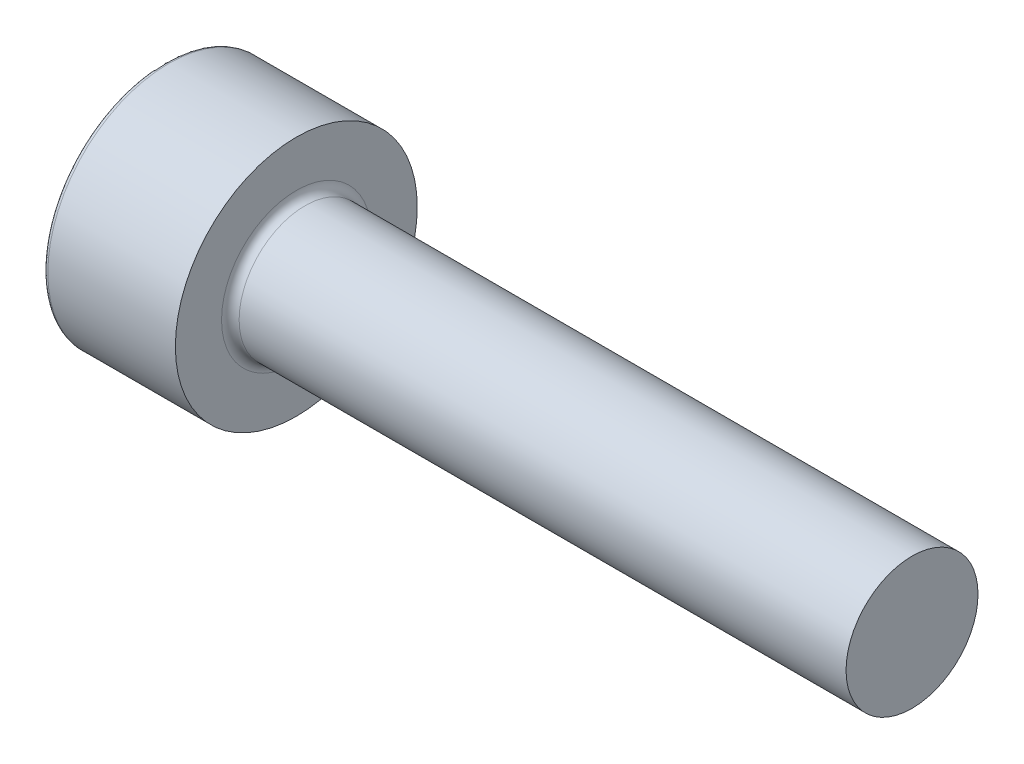
ISO-10303-21;
HEADER;
FILE_DESCRIPTION(('STEP AP214'),'2;1');
FILE_NAME('part.step','',(''),(''),'','','');
FILE_SCHEMA(('AUTOMOTIVE_DESIGN { 1 0 10303 214 1 1 1 1 }'));
ENDSEC;
DATA;
#1=APPLICATION_CONTEXT('core data for automotive mechanical design processes');
#2=APPLICATION_PROTOCOL_DEFINITION('international standard','automotive_design',2000,#1);
#3=PRODUCT_CONTEXT('',#1,'mechanical');
#4=PRODUCT('Part','Part','',(#3));
#5=PRODUCT_RELATED_PRODUCT_CATEGORY('part','',(#4));
#6=PRODUCT_DEFINITION_FORMATION('','',#4);
#7=PRODUCT_DEFINITION_CONTEXT('part definition',#1,'design');
#8=PRODUCT_DEFINITION('design','',#6,#7);
#9=PRODUCT_DEFINITION_SHAPE('','',#8);
#10=(LENGTH_UNIT() NAMED_UNIT(*) SI_UNIT(.MILLI.,.METRE.));
#11=(NAMED_UNIT(*) PLANE_ANGLE_UNIT() SI_UNIT($,.RADIAN.));
#12=(NAMED_UNIT(*) SI_UNIT($,.STERADIAN.) SOLID_ANGLE_UNIT());
#13=UNCERTAINTY_MEASURE_WITH_UNIT(LENGTH_MEASURE(1.E-05),#10,'distance_accuracy_value','');
#14=(GEOMETRIC_REPRESENTATION_CONTEXT(3) GLOBAL_UNCERTAINTY_ASSIGNED_CONTEXT((#13)) GLOBAL_UNIT_ASSIGNED_CONTEXT((#10,
#11,#12)) REPRESENTATION_CONTEXT('',''));
#15=CARTESIAN_POINT('',(0.,0.,0.));
#16=DIRECTION('',(0.,0.,1.));
#17=DIRECTION('',(1.,0.,0.));
#18=AXIS2_PLACEMENT_3D('',#15,#16,#17);
#19=CARTESIAN_POINT('',(0.,0.,0.));
#20=DIRECTION('',(1.,0.,0.));
#21=DIRECTION('',(0.,0.,-1.));
#22=AXIS2_PLACEMENT_3D('',#19,#20,#21);
#23=PLANE('',#22);
#24=CARTESIAN_POINT('',(0.,0.,0.));
#25=DIRECTION('',(1.,0.,0.));
#26=DIRECTION('',(0.,0.,-1.));
#27=AXIS2_PLACEMENT_3D('',#24,#25,#26);
#28=CIRCLE('',#27,2.65);
#29=CARTESIAN_POINT('',(0.,0.,-2.65));
#30=VERTEX_POINT('',#29);
#31=EDGE_CURVE('E46',#30,#30,#28,.F.);
#32=ORIENTED_EDGE('',*,*,#31,.T.);
#33=EDGE_LOOP('',(#32));
#34=FACE_BOUND('',#33,.T.);
#35=DIRECTION('',(0.,0.866025403784439,-0.5));
#36=VECTOR('',#35,1.);
#37=CARTESIAN_POINT('',(0.,0.,1.435));
#38=LINE('',#37,#36);
#39=CARTESIAN_POINT('',(0.,0.,1.435));
#40=VERTEX_POINT('',#39);
#41=CARTESIAN_POINT('',(0.,1.24274645443067,0.717499999999999));
#42=VERTEX_POINT('',#41);
#43=EDGE_CURVE('E127',#40,#42,#38,.T.);
#44=ORIENTED_EDGE('',*,*,#43,.F.);
#45=DIRECTION('',(0.,0.866025403784439,0.5));
#46=VECTOR('',#45,1.);
#47=CARTESIAN_POINT('',(0.,-1.24274645443067,0.7175));
#48=LINE('',#47,#46);
#49=CARTESIAN_POINT('',(0.,-1.24274645443067,0.7175));
#50=VERTEX_POINT('',#49);
#51=EDGE_CURVE('E53',#50,#40,#48,.T.);
#52=ORIENTED_EDGE('',*,*,#51,.F.);
#53=DIRECTION('',(0.,0.,1.));
#54=VECTOR('',#53,1.);
#55=CARTESIAN_POINT('',(0.,-1.24274645443067,-0.7175));
#56=LINE('',#55,#54);
#57=CARTESIAN_POINT('',(0.,-1.24274645443067,-0.7175));
#58=VERTEX_POINT('',#57);
#59=EDGE_CURVE('E137',#58,#50,#56,.T.);
#60=ORIENTED_EDGE('',*,*,#59,.F.);
#61=DIRECTION('',(0.,-0.866025403784439,0.5));
#62=VECTOR('',#61,1.);
#63=CARTESIAN_POINT('',(0.,0.,-1.435));
#64=LINE('',#63,#62);
#65=CARTESIAN_POINT('',(0.,0.,-1.435));
#66=VERTEX_POINT('',#65);
#67=EDGE_CURVE('E135',#66,#58,#64,.T.);
#68=ORIENTED_EDGE('',*,*,#67,.F.);
#69=DIRECTION('',(0.,-0.866025403784439,-0.5));
#70=VECTOR('',#69,1.);
#71=CARTESIAN_POINT('',(0.,1.24274645443067,-0.7175));
#72=LINE('',#71,#70);
#73=CARTESIAN_POINT('',(0.,1.24274645443067,-0.7175));
#74=VERTEX_POINT('',#73);
#75=EDGE_CURVE('E101',#74,#66,#72,.T.);
#76=ORIENTED_EDGE('',*,*,#75,.F.);
#77=DIRECTION('',(0.,0.,-1.));
#78=VECTOR('',#77,1.);
#79=CARTESIAN_POINT('',(0.,1.24274645443067,0.717499999999999));
#80=LINE('',#79,#78);
#81=EDGE_CURVE('E131',#42,#74,#80,.T.);
#82=ORIENTED_EDGE('',*,*,#81,.F.);
#83=EDGE_LOOP('',(#44,#52,#60,#68,#76,#82));
#84=FACE_BOUND('',#83,.T.);
#85=ADVANCED_FACE('F38',(#34,#84),#23,.F.);
#86=CARTESIAN_POINT('',(0.,0.,0.));
#87=DIRECTION('',(-1.,0.,0.));
#88=DIRECTION('',(0.,0.,1.));
#89=AXIS2_PLACEMENT_3D('',#86,#87,#88);
#90=CYLINDRICAL_SURFACE('',#89,2.75);
#91=CARTESIAN_POINT('',(0.1,0.,0.));
#92=DIRECTION('',(1.,0.,0.));
#93=DIRECTION('',(0.,0.,-1.));
#94=AXIS2_PLACEMENT_3D('',#91,#92,#93);
#95=CIRCLE('',#94,2.75);
#96=CARTESIAN_POINT('',(0.1,0.,-2.75));
#97=VERTEX_POINT('',#96);
#98=EDGE_CURVE('E11',#97,#97,#95,.T.);
#99=ORIENTED_EDGE('',*,*,#98,.T.);
#100=EDGE_LOOP('',(#99));
#101=FACE_BOUND('',#100,.T.);
#102=CARTESIAN_POINT('',(3.,0.,0.));
#103=DIRECTION('',(-1.,0.,0.));
#104=DIRECTION('',(0.,0.,1.));
#105=AXIS2_PLACEMENT_3D('',#102,#103,#104);
#106=CIRCLE('',#105,2.75);
#107=CARTESIAN_POINT('',(3.,0.,2.75));
#108=VERTEX_POINT('',#107);
#109=EDGE_CURVE('E152',#108,#108,#106,.T.);
#110=ORIENTED_EDGE('',*,*,#109,.T.);
#111=EDGE_LOOP('',(#110));
#112=FACE_BOUND('',#111,.T.);
#113=ADVANCED_FACE('F172',(#101,#112),#90,.T.);
#114=CARTESIAN_POINT('',(3.,2.75,0.));
#115=DIRECTION('',(-1.,0.,0.));
#116=DIRECTION('',(0.,0.,1.));
#117=AXIS2_PLACEMENT_3D('',#114,#115,#116);
#118=PLANE('',#117);
#119=ORIENTED_EDGE('',*,*,#109,.F.);
#120=EDGE_LOOP('',(#119));
#121=FACE_BOUND('',#120,.T.);
#122=CARTESIAN_POINT('',(3.,0.,0.));
#123=DIRECTION('',(-1.,0.,0.));
#124=DIRECTION('',(0.,0.,1.));
#125=AXIS2_PLACEMENT_3D('',#122,#123,#124);
#126=CIRCLE('',#125,1.7);
#127=CARTESIAN_POINT('',(3.,0.,1.7));
#128=VERTEX_POINT('',#127);
#129=EDGE_CURVE('E149',#128,#128,#126,.T.);
#130=ORIENTED_EDGE('',*,*,#129,.T.);
#131=EDGE_LOOP('',(#130));
#132=FACE_BOUND('',#131,.T.);
#133=ADVANCED_FACE('F176',(#121,#132),#118,.F.);
#134=CARTESIAN_POINT('',(3.2,0.,0.));
#135=DIRECTION('',(-1.,0.,0.));
#136=DIRECTION('',(0.,0.,1.));
#137=AXIS2_PLACEMENT_3D('',#134,#135,#136);
#138=TOROIDAL_SURFACE('',#137,1.7,0.2);
#139=ORIENTED_EDGE('',*,*,#129,.F.);
#140=EDGE_LOOP('',(#139));
#141=FACE_BOUND('',#140,.T.);
#142=CARTESIAN_POINT('',(3.2,0.,0.));
#143=DIRECTION('',(-1.,0.,0.));
#144=DIRECTION('',(0.,0.,1.));
#145=AXIS2_PLACEMENT_3D('',#142,#143,#144);
#146=CIRCLE('',#145,1.5);
#147=CARTESIAN_POINT('',(3.2,0.,1.5));
#148=VERTEX_POINT('',#147);
#149=EDGE_CURVE('E141',#148,#148,#146,.T.);
#150=ORIENTED_EDGE('',*,*,#149,.T.);
#151=EDGE_LOOP('',(#150));
#152=FACE_BOUND('',#151,.T.);
#153=ADVANCED_FACE('F182',(#141,#152),#138,.F.);
#154=CARTESIAN_POINT('',(0.,0.,0.));
#155=DIRECTION('',(-1.,0.,0.));
#156=DIRECTION('',(0.,0.,1.));
#157=AXIS2_PLACEMENT_3D('',#154,#155,#156);
#158=CYLINDRICAL_SURFACE('',#157,1.5);
#159=ORIENTED_EDGE('',*,*,#149,.F.);
#160=EDGE_LOOP('',(#159));
#161=FACE_BOUND('',#160,.T.);
#162=CARTESIAN_POINT('',(17.,0.,0.));
#163=DIRECTION('',(1.,0.,0.));
#164=DIRECTION('',(0.,0.,-1.));
#165=AXIS2_PLACEMENT_3D('',#162,#163,#164);
#166=CIRCLE('',#165,1.5);
#167=CARTESIAN_POINT('',(17.,0.,-1.5));
#168=VERTEX_POINT('',#167);
#169=EDGE_CURVE('E128',#168,#168,#166,.T.);
#170=ORIENTED_EDGE('',*,*,#169,.F.);
#171=EDGE_LOOP('',(#170));
#172=FACE_BOUND('',#171,.T.);
#173=ADVANCED_FACE('F186',(#161,#172),#158,.T.);
#174=CARTESIAN_POINT('',(1.3,-1.24274645443067,0.7175));
#175=DIRECTION('',(0.,-0.5,0.866025403784439));
#176=DIRECTION('',(0.,-0.866025403784439,-0.5));
#177=AXIS2_PLACEMENT_3D('',#174,#175,#176);
#178=PLANE('',#177);
#179=ORIENTED_EDGE('',*,*,#51,.T.);
#180=DIRECTION('',(-1.,0.,0.));
#181=VECTOR('',#180,1.);
#182=CARTESIAN_POINT('',(1.3,0.,1.435));
#183=LINE('',#182,#181);
#184=CARTESIAN_POINT('',(1.3,0.,1.435));
#185=VERTEX_POINT('',#184);
#186=EDGE_CURVE('E83',#185,#40,#183,.T.);
#187=ORIENTED_EDGE('',*,*,#186,.F.);
#188=DIRECTION('',(0.,0.866025403784439,0.5));
#189=VECTOR('',#188,1.);
#190=CARTESIAN_POINT('',(1.3,-1.24274645443067,0.7175));
#191=LINE('',#190,#189);
#192=CARTESIAN_POINT('',(1.3,-1.24274645443067,0.7175));
#193=VERTEX_POINT('',#192);
#194=EDGE_CURVE('E139',#193,#185,#191,.T.);
#195=ORIENTED_EDGE('',*,*,#194,.F.);
#196=DIRECTION('',(-1.,0.,0.));
#197=VECTOR('',#196,1.);
#198=CARTESIAN_POINT('',(1.3,-1.24274645443067,0.7175));
#199=LINE('',#198,#197);
#200=EDGE_CURVE('E61',#193,#50,#199,.T.);
#201=ORIENTED_EDGE('',*,*,#200,.T.);
#202=EDGE_LOOP('',(#179,#187,#195,#201));
#203=FACE_BOUND('',#202,.T.);
#204=ADVANCED_FACE('F190',(#203),#178,.F.);
#205=CARTESIAN_POINT('',(1.3,-1.24274645443067,-0.7175));
#206=DIRECTION('',(0.,-1.,0.));
#207=DIRECTION('',(0.,0.,-1.));
#208=AXIS2_PLACEMENT_3D('',#205,#206,#207);
#209=PLANE('',#208);
#210=ORIENTED_EDGE('',*,*,#59,.T.);
#211=ORIENTED_EDGE('',*,*,#200,.F.);
#212=DIRECTION('',(0.,0.,1.));
#213=VECTOR('',#212,1.);
#214=CARTESIAN_POINT('',(1.3,-1.24274645443067,-0.7175));
#215=LINE('',#214,#213);
#216=CARTESIAN_POINT('',(1.3,-1.24274645443067,-0.7175));
#217=VERTEX_POINT('',#216);
#218=EDGE_CURVE('E113',#217,#193,#215,.T.);
#219=ORIENTED_EDGE('',*,*,#218,.F.);
#220=DIRECTION('',(-1.,0.,0.));
#221=VECTOR('',#220,1.);
#222=CARTESIAN_POINT('',(1.3,-1.24274645443067,-0.7175));
#223=LINE('',#222,#221);
#224=EDGE_CURVE('E105',#217,#58,#223,.T.);
#225=ORIENTED_EDGE('',*,*,#224,.T.);
#226=EDGE_LOOP('',(#210,#211,#219,#225));
#227=FACE_BOUND('',#226,.T.);
#228=ADVANCED_FACE('F194',(#227),#209,.F.);
#229=CARTESIAN_POINT('',(1.3,0.,-1.435));
#230=DIRECTION('',(0.,-0.5,-0.866025403784439));
#231=DIRECTION('',(0.,0.866025403784439,-0.5));
#232=AXIS2_PLACEMENT_3D('',#229,#230,#231);
#233=PLANE('',#232);
#234=ORIENTED_EDGE('',*,*,#67,.T.);
#235=ORIENTED_EDGE('',*,*,#224,.F.);
#236=DIRECTION('',(0.,-0.866025403784439,0.5));
#237=VECTOR('',#236,1.);
#238=CARTESIAN_POINT('',(1.3,0.,-1.435));
#239=LINE('',#238,#237);
#240=CARTESIAN_POINT('',(1.3,0.,-1.435));
#241=VERTEX_POINT('',#240);
#242=EDGE_CURVE('E109',#241,#217,#239,.T.);
#243=ORIENTED_EDGE('',*,*,#242,.F.);
#244=DIRECTION('',(-1.,0.,0.));
#245=VECTOR('',#244,1.);
#246=CARTESIAN_POINT('',(1.3,0.,-1.435));
#247=LINE('',#246,#245);
#248=EDGE_CURVE('E94',#241,#66,#247,.T.);
#249=ORIENTED_EDGE('',*,*,#248,.T.);
#250=EDGE_LOOP('',(#234,#235,#243,#249));
#251=FACE_BOUND('',#250,.T.);
#252=ADVANCED_FACE('F110',(#251),#233,.F.);
#253=CARTESIAN_POINT('',(1.3,1.24274645443067,-0.7175));
#254=DIRECTION('',(0.,0.5,-0.866025403784439));
#255=DIRECTION('',(0.,0.866025403784439,0.5));
#256=AXIS2_PLACEMENT_3D('',#253,#254,#255);
#257=PLANE('',#256);
#258=ORIENTED_EDGE('',*,*,#75,.T.);
#259=ORIENTED_EDGE('',*,*,#248,.F.);
#260=DIRECTION('',(0.,-0.866025403784439,-0.5));
#261=VECTOR('',#260,1.);
#262=CARTESIAN_POINT('',(1.3,1.24274645443067,-0.7175));
#263=LINE('',#262,#261);
#264=CARTESIAN_POINT('',(1.3,1.24274645443067,-0.7175));
#265=VERTEX_POINT('',#264);
#266=EDGE_CURVE('E98',#265,#241,#263,.T.);
#267=ORIENTED_EDGE('',*,*,#266,.F.);
#268=DIRECTION('',(-1.,0.,0.));
#269=VECTOR('',#268,1.);
#270=CARTESIAN_POINT('',(1.3,1.24274645443067,-0.7175));
#271=LINE('',#270,#269);
#272=EDGE_CURVE('E106',#265,#74,#271,.T.);
#273=ORIENTED_EDGE('',*,*,#272,.T.);
#274=EDGE_LOOP('',(#258,#259,#267,#273));
#275=FACE_BOUND('',#274,.T.);
#276=ADVANCED_FACE('F96',(#275),#257,.F.);
#277=CARTESIAN_POINT('',(1.3,1.24274645443067,0.717499999999999));
#278=DIRECTION('',(0.,1.,0.));
#279=DIRECTION('',(0.,0.,1.));
#280=AXIS2_PLACEMENT_3D('',#277,#278,#279);
#281=PLANE('',#280);
#282=ORIENTED_EDGE('',*,*,#81,.T.);
#283=ORIENTED_EDGE('',*,*,#272,.F.);
#284=DIRECTION('',(0.,0.,-1.));
#285=VECTOR('',#284,1.);
#286=CARTESIAN_POINT('',(1.3,1.24274645443067,0.717499999999999));
#287=LINE('',#286,#285);
#288=CARTESIAN_POINT('',(1.3,1.24274645443067,0.717499999999999));
#289=VERTEX_POINT('',#288);
#290=EDGE_CURVE('E119',#289,#265,#287,.T.);
#291=ORIENTED_EDGE('',*,*,#290,.F.);
#292=DIRECTION('',(-1.,0.,0.));
#293=VECTOR('',#292,1.);
#294=CARTESIAN_POINT('',(1.3,1.24274645443067,0.717499999999999));
#295=LINE('',#294,#293);
#296=EDGE_CURVE('E144',#289,#42,#295,.T.);
#297=ORIENTED_EDGE('',*,*,#296,.T.);
#298=EDGE_LOOP('',(#282,#283,#291,#297));
#299=FACE_BOUND('',#298,.T.);
#300=ADVANCED_FACE('F197',(#299),#281,.F.);
#301=CARTESIAN_POINT('',(1.3,0.,1.435));
#302=DIRECTION('',(0.,0.5,0.866025403784439));
#303=DIRECTION('',(0.,-0.866025403784439,0.5));
#304=AXIS2_PLACEMENT_3D('',#301,#302,#303);
#305=PLANE('',#304);
#306=ORIENTED_EDGE('',*,*,#43,.T.);
#307=ORIENTED_EDGE('',*,*,#296,.F.);
#308=DIRECTION('',(0.,0.866025403784439,-0.5));
#309=VECTOR('',#308,1.);
#310=CARTESIAN_POINT('',(1.3,0.,1.435));
#311=LINE('',#310,#309);
#312=EDGE_CURVE('E121',#185,#289,#311,.T.);
#313=ORIENTED_EDGE('',*,*,#312,.F.);
#314=ORIENTED_EDGE('',*,*,#186,.T.);
#315=EDGE_LOOP('',(#306,#307,#313,#314));
#316=FACE_BOUND('',#315,.T.);
#317=ADVANCED_FACE('F168',(#316),#305,.F.);
#318=CARTESIAN_POINT('',(1.3,-1.24274645443067,0.7175));
#319=DIRECTION('',(1.,0.,0.));
#320=DIRECTION('',(0.,0.,-1.));
#321=AXIS2_PLACEMENT_3D('',#318,#319,#320);
#322=PLANE('',#321);
#323=ORIENTED_EDGE('',*,*,#194,.T.);
#324=ORIENTED_EDGE('',*,*,#312,.T.);
#325=ORIENTED_EDGE('',*,*,#290,.T.);
#326=ORIENTED_EDGE('',*,*,#266,.T.);
#327=ORIENTED_EDGE('',*,*,#242,.T.);
#328=ORIENTED_EDGE('',*,*,#218,.T.);
#329=EDGE_LOOP('',(#323,#324,#325,#326,#327,#328));
#330=FACE_BOUND('',#329,.T.);
#331=ADVANCED_FACE('F116',(#330),#322,.F.);
#332=CARTESIAN_POINT('',(0.1,0.,0.));
#333=DIRECTION('',(1.,0.,0.));
#334=DIRECTION('',(0.,0.,-1.));
#335=AXIS2_PLACEMENT_3D('',#332,#333,#334);
#336=TOROIDAL_SURFACE('',#335,2.65,0.1);
#337=ORIENTED_EDGE('',*,*,#98,.F.);
#338=EDGE_LOOP('',(#337));
#339=FACE_BOUND('',#338,.T.);
#340=ORIENTED_EDGE('',*,*,#31,.F.);
#341=EDGE_LOOP('',(#340));
#342=FACE_BOUND('',#341,.T.);
#343=ADVANCED_FACE('F40',(#339,#342),#336,.T.);
#344=CARTESIAN_POINT('',(17.,0.,0.));
#345=DIRECTION('',(1.,0.,0.));
#346=DIRECTION('',(0.,0.,-1.));
#347=AXIS2_PLACEMENT_3D('',#344,#345,#346);
#348=PLANE('',#347);
#349=ORIENTED_EDGE('',*,*,#169,.T.);
#350=EDGE_LOOP('',(#349));
#351=FACE_BOUND('',#350,.T.);
#352=ADVANCED_FACE('F160',(#351),#348,.T.);
#353=CLOSED_SHELL('',(#85,#113,#133,#153,#173,#204,#228,#252,#276,#300,#317,#331,#343,#352));
#354=MANIFOLD_SOLID_BREP('B2',#353);
#355=ADVANCED_BREP_SHAPE_REPRESENTATION('',(#18,#354),#14);
#356=SHAPE_DEFINITION_REPRESENTATION(#9,#355);
ENDSEC;
END-ISO-10303-21;
